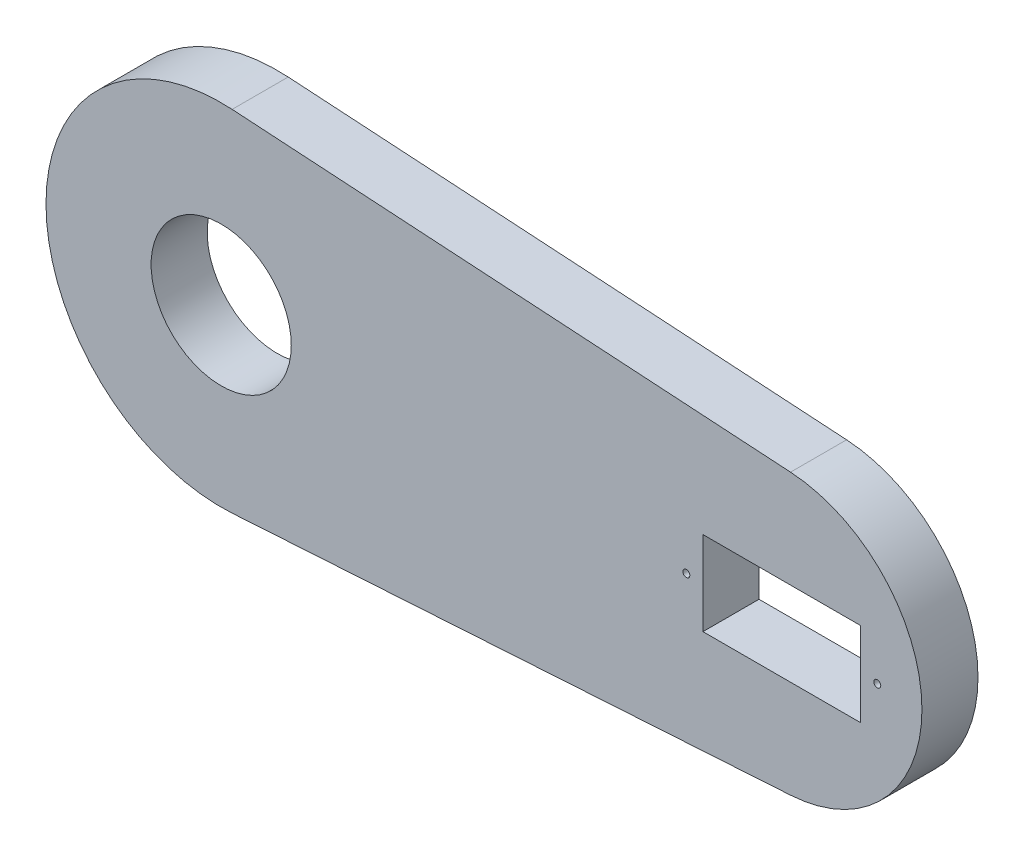
ISO-10303-21;
HEADER;
FILE_DESCRIPTION(('STEP AP214'),'2;1');
FILE_NAME('part.step','',(''),(''),'','','');
FILE_SCHEMA(('AUTOMOTIVE_DESIGN { 1 0 10303 214 1 1 1 1 }'));
ENDSEC;
DATA;
#1=APPLICATION_CONTEXT('core data for automotive mechanical design processes');
#2=APPLICATION_PROTOCOL_DEFINITION('international standard','automotive_design',2000,#1);
#3=PRODUCT_CONTEXT('',#1,'mechanical');
#4=PRODUCT('Part','Part','',(#3));
#5=PRODUCT_RELATED_PRODUCT_CATEGORY('part','',(#4));
#6=PRODUCT_DEFINITION_FORMATION('','',#4);
#7=PRODUCT_DEFINITION_CONTEXT('part definition',#1,'design');
#8=PRODUCT_DEFINITION('design','',#6,#7);
#9=PRODUCT_DEFINITION_SHAPE('','',#8);
#10=(LENGTH_UNIT() NAMED_UNIT(*) SI_UNIT(.MILLI.,.METRE.));
#11=(NAMED_UNIT(*) PLANE_ANGLE_UNIT() SI_UNIT($,.RADIAN.));
#12=(NAMED_UNIT(*) SI_UNIT($,.STERADIAN.) SOLID_ANGLE_UNIT());
#13=UNCERTAINTY_MEASURE_WITH_UNIT(LENGTH_MEASURE(1.E-05),#10,'distance_accuracy_value','');
#14=(GEOMETRIC_REPRESENTATION_CONTEXT(3) GLOBAL_UNCERTAINTY_ASSIGNED_CONTEXT((#13)) GLOBAL_UNIT_ASSIGNED_CONTEXT((#10,
#11,#12)) REPRESENTATION_CONTEXT('',''));
#15=CARTESIAN_POINT('',(0.,0.,0.));
#16=DIRECTION('',(0.,0.,1.));
#17=DIRECTION('',(1.,0.,0.));
#18=AXIS2_PLACEMENT_3D('',#15,#16,#17);
#19=CARTESIAN_POINT('',(0.,0.,-8.));
#20=DIRECTION('',(0.,0.,1.));
#21=DIRECTION('',(1.,0.,0.));
#22=AXIS2_PLACEMENT_3D('',#19,#20,#21);
#23=CYLINDRICAL_SURFACE('',#22,25.);
#24=CARTESIAN_POINT('',(0.,0.,0.));
#25=DIRECTION('',(0.,0.,1.));
#26=DIRECTION('',(1.,0.,0.));
#27=AXIS2_PLACEMENT_3D('',#24,#25,#26);
#28=CIRCLE('',#27,25.);
#29=CARTESIAN_POINT('',(1.5625,24.9511240979239,0.));
#30=VERTEX_POINT('',#29);
#31=CARTESIAN_POINT('',(1.5625,-24.9511240979239,0.));
#32=VERTEX_POINT('',#31);
#33=EDGE_CURVE('E145',#30,#32,#28,.T.);
#34=ORIENTED_EDGE('',*,*,#33,.F.);
#35=DIRECTION('',(0.,0.,1.));
#36=VECTOR('',#35,1.);
#37=CARTESIAN_POINT('',(1.5625,24.9511240979239,-8.));
#38=LINE('',#37,#36);
#39=CARTESIAN_POINT('',(1.5625,24.9511240979239,-8.));
#40=VERTEX_POINT('',#39);
#41=EDGE_CURVE('E11',#40,#30,#38,.T.);
#42=ORIENTED_EDGE('',*,*,#41,.F.);
#43=CARTESIAN_POINT('',(0.,0.,-8.));
#44=DIRECTION('',(0.,0.,1.));
#45=DIRECTION('',(1.,0.,0.));
#46=AXIS2_PLACEMENT_3D('',#43,#44,#45);
#47=CIRCLE('',#46,25.);
#48=CARTESIAN_POINT('',(1.5625,-24.9511240979239,-8.));
#49=VERTEX_POINT('',#48);
#50=EDGE_CURVE('E148',#40,#49,#47,.T.);
#51=ORIENTED_EDGE('',*,*,#50,.T.);
#52=DIRECTION('',(0.,0.,1.));
#53=VECTOR('',#52,1.);
#54=CARTESIAN_POINT('',(1.5625,-24.9511240979239,-8.));
#55=LINE('',#54,#53);
#56=EDGE_CURVE('E39',#49,#32,#55,.T.);
#57=ORIENTED_EDGE('',*,*,#56,.T.);
#58=EDGE_LOOP('',(#34,#42,#51,#57));
#59=FACE_BOUND('',#58,.T.);
#60=ADVANCED_FACE('F36',(#59),#23,.T.);
#61=CARTESIAN_POINT('',(1.5625,24.9511240979239,-8.));
#62=DIRECTION('',(0.0624999999999999,0.998044963916957,0.));
#63=DIRECTION('',(-0.998044963916957,0.0624999999999999,0.));
#64=AXIS2_PLACEMENT_3D('',#61,#62,#63);
#65=PLANE('',#64);
#66=DIRECTION('',(-0.998044963916957,0.0624999999999999,0.));
#67=VECTOR('',#66,1.);
#68=CARTESIAN_POINT('',(1.5625,24.9511240979239,0.));
#69=LINE('',#68,#67);
#70=CARTESIAN_POINT('',(81.25,19.9608992783391,0.));
#71=VERTEX_POINT('',#70);
#72=EDGE_CURVE('E152',#71,#30,#69,.T.);
#73=ORIENTED_EDGE('',*,*,#72,.F.);
#74=DIRECTION('',(0.,0.,1.));
#75=VECTOR('',#74,1.);
#76=CARTESIAN_POINT('',(81.25,19.9608992783391,-8.));
#77=LINE('',#76,#75);
#78=CARTESIAN_POINT('',(81.25,19.9608992783391,-8.));
#79=VERTEX_POINT('',#78);
#80=EDGE_CURVE('E44',#79,#71,#77,.T.);
#81=ORIENTED_EDGE('',*,*,#80,.F.);
#82=DIRECTION('',(-0.998044963916957,0.0624999999999999,0.));
#83=VECTOR('',#82,1.);
#84=CARTESIAN_POINT('',(1.5625,24.9511240979239,-8.));
#85=LINE('',#84,#83);
#86=EDGE_CURVE('E158',#79,#40,#85,.T.);
#87=ORIENTED_EDGE('',*,*,#86,.T.);
#88=ORIENTED_EDGE('',*,*,#41,.T.);
#89=EDGE_LOOP('',(#73,#81,#87,#88));
#90=FACE_BOUND('',#89,.T.);
#91=ADVANCED_FACE('F184',(#90),#65,.T.);
#92=CARTESIAN_POINT('',(80.,0.,-8.));
#93=DIRECTION('',(0.,0.,1.));
#94=DIRECTION('',(1.,0.,0.));
#95=AXIS2_PLACEMENT_3D('',#92,#93,#94);
#96=CYLINDRICAL_SURFACE('',#95,20.);
#97=CARTESIAN_POINT('',(80.,0.,0.));
#98=DIRECTION('',(0.,0.,1.));
#99=DIRECTION('',(1.,0.,0.));
#100=AXIS2_PLACEMENT_3D('',#97,#98,#99);
#101=CIRCLE('',#100,20.);
#102=CARTESIAN_POINT('',(81.25,-19.9608992783391,0.));
#103=VERTEX_POINT('',#102);
#104=EDGE_CURVE('E166',#103,#71,#101,.T.);
#105=ORIENTED_EDGE('',*,*,#104,.F.);
#106=DIRECTION('',(0.,0.,1.));
#107=VECTOR('',#106,1.);
#108=CARTESIAN_POINT('',(81.25,-19.9608992783391,-8.));
#109=LINE('',#108,#107);
#110=CARTESIAN_POINT('',(81.25,-19.9608992783391,-8.));
#111=VERTEX_POINT('',#110);
#112=EDGE_CURVE('E171',#111,#103,#109,.T.);
#113=ORIENTED_EDGE('',*,*,#112,.F.);
#114=CARTESIAN_POINT('',(80.,0.,-8.));
#115=DIRECTION('',(0.,0.,1.));
#116=DIRECTION('',(1.,0.,0.));
#117=AXIS2_PLACEMENT_3D('',#114,#115,#116);
#118=CIRCLE('',#117,20.);
#119=EDGE_CURVE('E155',#111,#79,#118,.T.);
#120=ORIENTED_EDGE('',*,*,#119,.T.);
#121=ORIENTED_EDGE('',*,*,#80,.T.);
#122=EDGE_LOOP('',(#105,#113,#120,#121));
#123=FACE_BOUND('',#122,.T.);
#124=ADVANCED_FACE('F189',(#123),#96,.T.);
#125=CARTESIAN_POINT('',(81.25,-19.9608992783391,-8.));
#126=DIRECTION('',(0.0625,-0.998044963916957,0.));
#127=DIRECTION('',(0.998044963916957,0.0625,0.));
#128=AXIS2_PLACEMENT_3D('',#125,#126,#127);
#129=PLANE('',#128);
#130=DIRECTION('',(0.998044963916957,0.0625,0.));
#131=VECTOR('',#130,1.);
#132=CARTESIAN_POINT('',(81.25,-19.9608992783391,0.));
#133=LINE('',#132,#131);
#134=EDGE_CURVE('E163',#32,#103,#133,.T.);
#135=ORIENTED_EDGE('',*,*,#134,.F.);
#136=ORIENTED_EDGE('',*,*,#56,.F.);
#137=DIRECTION('',(0.998044963916957,0.0625,0.));
#138=VECTOR('',#137,1.);
#139=CARTESIAN_POINT('',(81.25,-19.9608992783391,-8.));
#140=LINE('',#139,#138);
#141=EDGE_CURVE('E151',#49,#111,#140,.T.);
#142=ORIENTED_EDGE('',*,*,#141,.T.);
#143=ORIENTED_EDGE('',*,*,#112,.T.);
#144=EDGE_LOOP('',(#135,#136,#142,#143));
#145=FACE_BOUND('',#144,.T.);
#146=ADVANCED_FACE('F179',(#145),#129,.T.);
#147=CARTESIAN_POINT('',(0.,0.,-8.));
#148=DIRECTION('',(0.,0.,1.));
#149=DIRECTION('',(1.,0.,0.));
#150=AXIS2_PLACEMENT_3D('',#147,#148,#149);
#151=PLANE('',#150);
#152=CARTESIAN_POINT('',(0.,0.,-8.));
#153=DIRECTION('',(0.,0.,1.));
#154=DIRECTION('',(1.,0.,0.));
#155=AXIS2_PLACEMENT_3D('',#152,#153,#154);
#156=CIRCLE('',#155,10.);
#157=CARTESIAN_POINT('',(10.,0.,-8.));
#158=VERTEX_POINT('',#157);
#159=EDGE_CURVE('E304',#158,#158,#156,.T.);
#160=ORIENTED_EDGE('',*,*,#159,.T.);
#161=EDGE_LOOP('',(#160));
#162=FACE_BOUND('',#161,.T.);
#163=CARTESIAN_POINT('',(93.625,0.,-8.));
#164=DIRECTION('',(0.,0.,1.));
#165=DIRECTION('',(1.,0.,0.));
#166=AXIS2_PLACEMENT_3D('',#163,#164,#165);
#167=CIRCLE('',#166,0.499999999999999);
#168=CARTESIAN_POINT('',(94.125,0.,-8.));
#169=VERTEX_POINT('',#168);
#170=EDGE_CURVE('E132',#169,#169,#167,.T.);
#171=ORIENTED_EDGE('',*,*,#170,.T.);
#172=EDGE_LOOP('',(#171));
#173=FACE_BOUND('',#172,.T.);
#174=DIRECTION('',(1.,0.,0.));
#175=VECTOR('',#174,1.);
#176=CARTESIAN_POINT('',(91.25,-6.,-8.));
#177=LINE('',#176,#175);
#178=CARTESIAN_POINT('',(68.75,-6.,-8.));
#179=VERTEX_POINT('',#178);
#180=CARTESIAN_POINT('',(91.25,-6.,-8.));
#181=VERTEX_POINT('',#180);
#182=EDGE_CURVE('E109',#179,#181,#177,.T.);
#183=ORIENTED_EDGE('',*,*,#182,.T.);
#184=DIRECTION('',(0.,1.,0.));
#185=VECTOR('',#184,1.);
#186=CARTESIAN_POINT('',(91.25,-6.,-8.));
#187=LINE('',#186,#185);
#188=CARTESIAN_POINT('',(91.25,6.,-8.));
#189=VERTEX_POINT('',#188);
#190=EDGE_CURVE('E103',#181,#189,#187,.T.);
#191=ORIENTED_EDGE('',*,*,#190,.T.);
#192=DIRECTION('',(-1.,0.,0.));
#193=VECTOR('',#192,1.);
#194=CARTESIAN_POINT('',(91.25,6.,-8.));
#195=LINE('',#194,#193);
#196=CARTESIAN_POINT('',(68.75,6.,-8.));
#197=VERTEX_POINT('',#196);
#198=EDGE_CURVE('E112',#189,#197,#195,.T.);
#199=ORIENTED_EDGE('',*,*,#198,.T.);
#200=DIRECTION('',(0.,-1.,0.));
#201=VECTOR('',#200,1.);
#202=CARTESIAN_POINT('',(68.75,-6.,-8.));
#203=LINE('',#202,#201);
#204=EDGE_CURVE('E52',#197,#179,#203,.T.);
#205=ORIENTED_EDGE('',*,*,#204,.T.);
#206=EDGE_LOOP('',(#183,#191,#199,#205));
#207=FACE_BOUND('',#206,.T.);
#208=CARTESIAN_POINT('',(66.375,0.,-8.));
#209=DIRECTION('',(0.,0.,1.));
#210=DIRECTION('',(1.,0.,0.));
#211=AXIS2_PLACEMENT_3D('',#208,#209,#210);
#212=CIRCLE('',#211,0.499999999999999);
#213=CARTESIAN_POINT('',(66.875,0.,-8.));
#214=VERTEX_POINT('',#213);
#215=EDGE_CURVE('E142',#214,#214,#212,.T.);
#216=ORIENTED_EDGE('',*,*,#215,.T.);
#217=EDGE_LOOP('',(#216));
#218=FACE_BOUND('',#217,.T.);
#219=ORIENTED_EDGE('',*,*,#50,.F.);
#220=ORIENTED_EDGE('',*,*,#86,.F.);
#221=ORIENTED_EDGE('',*,*,#119,.F.);
#222=ORIENTED_EDGE('',*,*,#141,.F.);
#223=EDGE_LOOP('',(#219,#220,#221,#222));
#224=FACE_BOUND('',#223,.T.);
#225=ADVANCED_FACE('F116',(#162,#173,#207,#218,#224),#151,.F.);
#226=CARTESIAN_POINT('',(0.,0.,0.));
#227=DIRECTION('',(0.,0.,1.));
#228=DIRECTION('',(1.,0.,0.));
#229=AXIS2_PLACEMENT_3D('',#226,#227,#228);
#230=PLANE('',#229);
#231=CARTESIAN_POINT('',(0.,0.,0.));
#232=DIRECTION('',(0.,0.,1.));
#233=DIRECTION('',(1.,0.,0.));
#234=AXIS2_PLACEMENT_3D('',#231,#232,#233);
#235=CIRCLE('',#234,10.);
#236=CARTESIAN_POINT('',(10.,0.,0.));
#237=VERTEX_POINT('',#236);
#238=EDGE_CURVE('E307',#237,#237,#235,.T.);
#239=ORIENTED_EDGE('',*,*,#238,.F.);
#240=EDGE_LOOP('',(#239));
#241=FACE_BOUND('',#240,.T.);
#242=CARTESIAN_POINT('',(93.625,0.,0.));
#243=DIRECTION('',(0.,0.,1.));
#244=DIRECTION('',(1.,0.,0.));
#245=AXIS2_PLACEMENT_3D('',#242,#243,#244);
#246=CIRCLE('',#245,0.499999999999999);
#247=CARTESIAN_POINT('',(94.125,0.,0.));
#248=VERTEX_POINT('',#247);
#249=EDGE_CURVE('E125',#248,#248,#246,.T.);
#250=ORIENTED_EDGE('',*,*,#249,.F.);
#251=EDGE_LOOP('',(#250));
#252=FACE_BOUND('',#251,.T.);
#253=DIRECTION('',(0.,1.,0.));
#254=VECTOR('',#253,1.);
#255=CARTESIAN_POINT('',(91.25,-6.,0.));
#256=LINE('',#255,#254);
#257=CARTESIAN_POINT('',(91.25,-6.,0.));
#258=VERTEX_POINT('',#257);
#259=CARTESIAN_POINT('',(91.25,6.,0.));
#260=VERTEX_POINT('',#259);
#261=EDGE_CURVE('E60',#258,#260,#256,.T.);
#262=ORIENTED_EDGE('',*,*,#261,.F.);
#263=DIRECTION('',(1.,0.,0.));
#264=VECTOR('',#263,1.);
#265=CARTESIAN_POINT('',(91.25,-6.,0.));
#266=LINE('',#265,#264);
#267=CARTESIAN_POINT('',(68.75,-6.,0.));
#268=VERTEX_POINT('',#267);
#269=EDGE_CURVE('E119',#268,#258,#266,.T.);
#270=ORIENTED_EDGE('',*,*,#269,.F.);
#271=DIRECTION('',(0.,-1.,0.));
#272=VECTOR('',#271,1.);
#273=CARTESIAN_POINT('',(68.75,-6.,0.));
#274=LINE('',#273,#272);
#275=CARTESIAN_POINT('',(68.75,6.,0.));
#276=VERTEX_POINT('',#275);
#277=EDGE_CURVE('E122',#276,#268,#274,.T.);
#278=ORIENTED_EDGE('',*,*,#277,.F.);
#279=DIRECTION('',(-1.,0.,0.));
#280=VECTOR('',#279,1.);
#281=CARTESIAN_POINT('',(91.25,6.,0.));
#282=LINE('',#281,#280);
#283=EDGE_CURVE('E131',#260,#276,#282,.T.);
#284=ORIENTED_EDGE('',*,*,#283,.F.);
#285=EDGE_LOOP('',(#262,#270,#278,#284));
#286=FACE_BOUND('',#285,.T.);
#287=CARTESIAN_POINT('',(66.375,0.,0.));
#288=DIRECTION('',(0.,0.,1.));
#289=DIRECTION('',(1.,0.,0.));
#290=AXIS2_PLACEMENT_3D('',#287,#288,#289);
#291=CIRCLE('',#290,0.499999999999999);
#292=CARTESIAN_POINT('',(66.875,0.,0.));
#293=VERTEX_POINT('',#292);
#294=EDGE_CURVE('E138',#293,#293,#291,.T.);
#295=ORIENTED_EDGE('',*,*,#294,.F.);
#296=EDGE_LOOP('',(#295));
#297=FACE_BOUND('',#296,.T.);
#298=ORIENTED_EDGE('',*,*,#33,.T.);
#299=ORIENTED_EDGE('',*,*,#134,.T.);
#300=ORIENTED_EDGE('',*,*,#104,.T.);
#301=ORIENTED_EDGE('',*,*,#72,.T.);
#302=EDGE_LOOP('',(#298,#299,#300,#301));
#303=FACE_BOUND('',#302,.T.);
#304=ADVANCED_FACE('F181',(#241,#252,#286,#297,#303),#230,.T.);
#305=CARTESIAN_POINT('',(66.375,0.,-8.));
#306=DIRECTION('',(0.,0.,1.));
#307=DIRECTION('',(1.,0.,0.));
#308=AXIS2_PLACEMENT_3D('',#305,#306,#307);
#309=CYLINDRICAL_SURFACE('',#308,0.499999999999999);
#310=ORIENTED_EDGE('',*,*,#215,.F.);
#311=EDGE_LOOP('',(#310));
#312=FACE_BOUND('',#311,.T.);
#313=ORIENTED_EDGE('',*,*,#294,.T.);
#314=EDGE_LOOP('',(#313));
#315=FACE_BOUND('',#314,.T.);
#316=ADVANCED_FACE('F221',(#312,#315),#309,.F.);
#317=CARTESIAN_POINT('',(91.25,-6.,-8.));
#318=DIRECTION('',(1.,0.,0.));
#319=DIRECTION('',(0.,0.,-1.));
#320=AXIS2_PLACEMENT_3D('',#317,#318,#319);
#321=PLANE('',#320);
#322=ORIENTED_EDGE('',*,*,#261,.T.);
#323=DIRECTION('',(0.,0.,1.));
#324=VECTOR('',#323,1.);
#325=CARTESIAN_POINT('',(91.25,6.,-8.));
#326=LINE('',#325,#324);
#327=EDGE_CURVE('E99',#189,#260,#326,.T.);
#328=ORIENTED_EDGE('',*,*,#327,.F.);
#329=ORIENTED_EDGE('',*,*,#190,.F.);
#330=DIRECTION('',(0.,0.,1.));
#331=VECTOR('',#330,1.);
#332=CARTESIAN_POINT('',(91.25,-6.,-8.));
#333=LINE('',#332,#331);
#334=EDGE_CURVE('E136',#181,#258,#333,.T.);
#335=ORIENTED_EDGE('',*,*,#334,.T.);
#336=EDGE_LOOP('',(#322,#328,#329,#335));
#337=FACE_BOUND('',#336,.T.);
#338=ADVANCED_FACE('F101',(#337),#321,.F.);
#339=CARTESIAN_POINT('',(91.25,-6.,-8.));
#340=DIRECTION('',(0.,-1.,0.));
#341=DIRECTION('',(1.,0.,0.));
#342=AXIS2_PLACEMENT_3D('',#339,#340,#341);
#343=PLANE('',#342);
#344=ORIENTED_EDGE('',*,*,#269,.T.);
#345=ORIENTED_EDGE('',*,*,#334,.F.);
#346=ORIENTED_EDGE('',*,*,#182,.F.);
#347=DIRECTION('',(0.,0.,1.));
#348=VECTOR('',#347,1.);
#349=CARTESIAN_POINT('',(68.75,-6.,-8.));
#350=LINE('',#349,#348);
#351=EDGE_CURVE('E139',#179,#268,#350,.T.);
#352=ORIENTED_EDGE('',*,*,#351,.T.);
#353=EDGE_LOOP('',(#344,#345,#346,#352));
#354=FACE_BOUND('',#353,.T.);
#355=ADVANCED_FACE('F237',(#354),#343,.F.);
#356=CARTESIAN_POINT('',(68.75,-6.,-8.));
#357=DIRECTION('',(-1.,0.,0.));
#358=DIRECTION('',(0.,0.,1.));
#359=AXIS2_PLACEMENT_3D('',#356,#357,#358);
#360=PLANE('',#359);
#361=ORIENTED_EDGE('',*,*,#277,.T.);
#362=ORIENTED_EDGE('',*,*,#351,.F.);
#363=ORIENTED_EDGE('',*,*,#204,.F.);
#364=DIRECTION('',(0.,0.,1.));
#365=VECTOR('',#364,1.);
#366=CARTESIAN_POINT('',(68.75,6.,-8.));
#367=LINE('',#366,#365);
#368=EDGE_CURVE('E108',#197,#276,#367,.T.);
#369=ORIENTED_EDGE('',*,*,#368,.T.);
#370=EDGE_LOOP('',(#361,#362,#363,#369));
#371=FACE_BOUND('',#370,.T.);
#372=ADVANCED_FACE('F246',(#371),#360,.F.);
#373=CARTESIAN_POINT('',(91.25,6.,-8.));
#374=DIRECTION('',(0.,1.,0.));
#375=DIRECTION('',(-1.,0.,0.));
#376=AXIS2_PLACEMENT_3D('',#373,#374,#375);
#377=PLANE('',#376);
#378=ORIENTED_EDGE('',*,*,#283,.T.);
#379=ORIENTED_EDGE('',*,*,#368,.F.);
#380=ORIENTED_EDGE('',*,*,#198,.F.);
#381=ORIENTED_EDGE('',*,*,#327,.T.);
#382=EDGE_LOOP('',(#378,#379,#380,#381));
#383=FACE_BOUND('',#382,.T.);
#384=ADVANCED_FACE('F113',(#383),#377,.F.);
#385=CARTESIAN_POINT('',(93.625,0.,-8.));
#386=DIRECTION('',(0.,0.,1.));
#387=DIRECTION('',(1.,0.,0.));
#388=AXIS2_PLACEMENT_3D('',#385,#386,#387);
#389=CYLINDRICAL_SURFACE('',#388,0.499999999999999);
#390=ORIENTED_EDGE('',*,*,#170,.F.);
#391=EDGE_LOOP('',(#390));
#392=FACE_BOUND('',#391,.T.);
#393=ORIENTED_EDGE('',*,*,#249,.T.);
#394=EDGE_LOOP('',(#393));
#395=FACE_BOUND('',#394,.T.);
#396=ADVANCED_FACE('F264',(#392,#395),#389,.F.);
#397=CARTESIAN_POINT('',(0.,0.,-8.));
#398=DIRECTION('',(0.,0.,1.));
#399=DIRECTION('',(1.,0.,0.));
#400=AXIS2_PLACEMENT_3D('',#397,#398,#399);
#401=CYLINDRICAL_SURFACE('',#400,10.);
#402=ORIENTED_EDGE('',*,*,#159,.F.);
#403=EDGE_LOOP('',(#402));
#404=FACE_BOUND('',#403,.T.);
#405=ORIENTED_EDGE('',*,*,#238,.T.);
#406=EDGE_LOOP('',(#405));
#407=FACE_BOUND('',#406,.T.);
#408=ADVANCED_FACE('F273',(#404,#407),#401,.F.);
#409=CLOSED_SHELL('',(#60,#91,#124,#146,#225,#304,#316,#338,#355,#372,#384,#396,#408));
#410=MANIFOLD_SOLID_BREP('B2',#409);
#411=ADVANCED_BREP_SHAPE_REPRESENTATION('',(#18,#410),#14);
#412=SHAPE_DEFINITION_REPRESENTATION(#9,#411);
ENDSEC;
END-ISO-10303-21;
